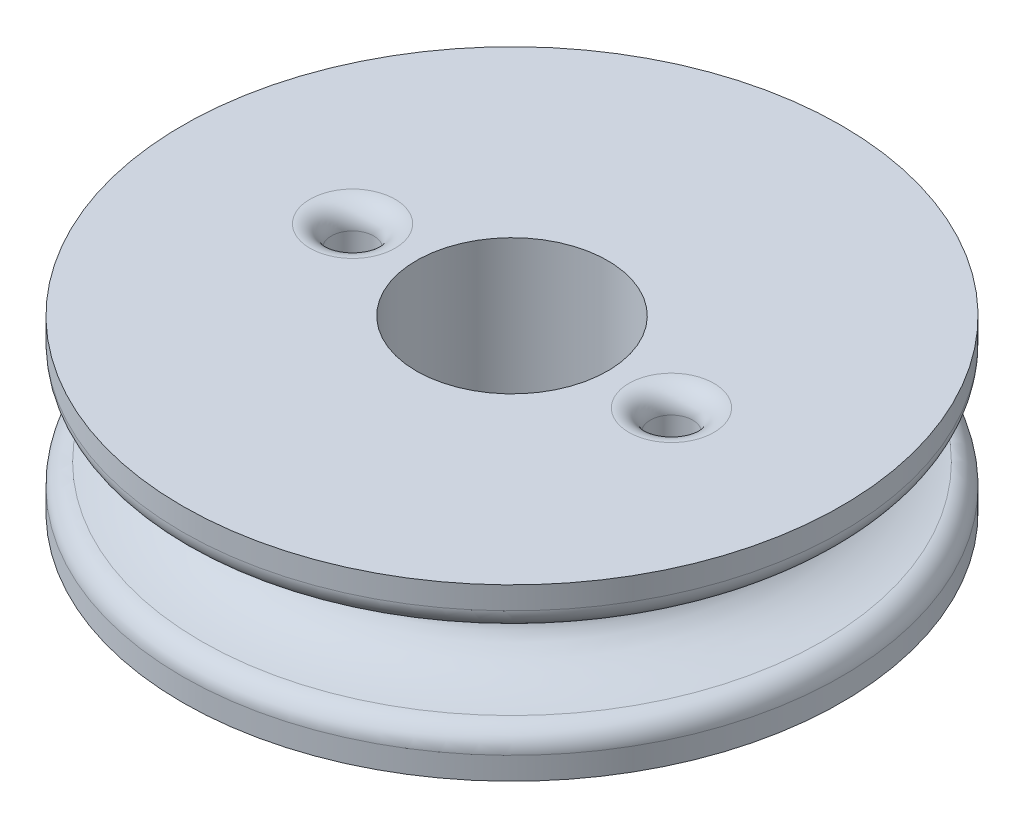
ISO-10303-21;
HEADER;
FILE_DESCRIPTION(('STEP AP214'),'2;1');
FILE_NAME('part.step','',(''),(''),'','','');
FILE_SCHEMA(('AUTOMOTIVE_DESIGN { 1 0 10303 214 1 1 1 1 }'));
ENDSEC;
DATA;
#1=APPLICATION_CONTEXT('core data for automotive mechanical design processes');
#2=APPLICATION_PROTOCOL_DEFINITION('international standard','automotive_design',2000,#1);
#3=PRODUCT_CONTEXT('',#1,'mechanical');
#4=PRODUCT('Part','Part','',(#3));
#5=PRODUCT_RELATED_PRODUCT_CATEGORY('part','',(#4));
#6=PRODUCT_DEFINITION_FORMATION('','',#4);
#7=PRODUCT_DEFINITION_CONTEXT('part definition',#1,'design');
#8=PRODUCT_DEFINITION('design','',#6,#7);
#9=PRODUCT_DEFINITION_SHAPE('','',#8);
#10=(LENGTH_UNIT() NAMED_UNIT(*) SI_UNIT(.MILLI.,.METRE.));
#11=(NAMED_UNIT(*) PLANE_ANGLE_UNIT() SI_UNIT($,.RADIAN.));
#12=(NAMED_UNIT(*) SI_UNIT($,.STERADIAN.) SOLID_ANGLE_UNIT());
#13=UNCERTAINTY_MEASURE_WITH_UNIT(LENGTH_MEASURE(1.E-05),#10,'distance_accuracy_value','');
#14=(GEOMETRIC_REPRESENTATION_CONTEXT(3) GLOBAL_UNCERTAINTY_ASSIGNED_CONTEXT((#13)) GLOBAL_UNIT_ASSIGNED_CONTEXT((#10,
#11,#12)) REPRESENTATION_CONTEXT('',''));
#15=CARTESIAN_POINT('',(0.,0.,0.));
#16=DIRECTION('',(0.,0.,1.));
#17=DIRECTION('',(1.,0.,0.));
#18=AXIS2_PLACEMENT_3D('',#15,#16,#17);
#19=CARTESIAN_POINT('',(0.,8.,0.));
#20=DIRECTION('',(0.,-1.,0.));
#21=DIRECTION('',(0.,0.,-1.));
#22=AXIS2_PLACEMENT_3D('',#19,#20,#21);
#23=CYLINDRICAL_SURFACE('',#22,15.5);
#24=CARTESIAN_POINT('',(0.,6.94380209251713,0.));
#25=DIRECTION('',(0.,-1.,0.));
#26=DIRECTION('',(0.,0.,-1.));
#27=AXIS2_PLACEMENT_3D('',#24,#25,#26);
#28=CIRCLE('',#27,15.5);
#29=CARTESIAN_POINT('',(0.,6.94380209251713,-15.5));
#30=VERTEX_POINT('',#29);
#31=EDGE_CURVE('E10',#30,#30,#28,.F.);
#32=ORIENTED_EDGE('',*,*,#31,.T.);
#33=EDGE_LOOP('',(#32));
#34=FACE_BOUND('',#33,.T.);
#35=CARTESIAN_POINT('',(0.,8.,0.));
#36=DIRECTION('',(0.,1.,0.));
#37=DIRECTION('',(0.,0.,1.));
#38=AXIS2_PLACEMENT_3D('',#35,#36,#37);
#39=CIRCLE('',#38,15.5);
#40=CARTESIAN_POINT('',(0.,8.,15.5));
#41=VERTEX_POINT('',#40);
#42=EDGE_CURVE('E63',#41,#41,#39,.T.);
#43=ORIENTED_EDGE('',*,*,#42,.F.);
#44=EDGE_LOOP('',(#43));
#45=FACE_BOUND('',#44,.T.);
#46=ADVANCED_FACE('F31',(#34,#45),#23,.T.);
#47=CARTESIAN_POINT('',(0.,8.,0.));
#48=DIRECTION('',(0.,1.,0.));
#49=DIRECTION('',(0.,0.,1.));
#50=AXIS2_PLACEMENT_3D('',#47,#48,#49);
#51=PLANE('',#50);
#52=CARTESIAN_POINT('',(7.5,8.,0.));
#53=DIRECTION('',(0.,1.,0.));
#54=DIRECTION('',(0.,0.,1.));
#55=AXIS2_PLACEMENT_3D('',#52,#53,#54);
#56=CIRCLE('',#55,2.);
#57=CARTESIAN_POINT('',(7.5,8.,2.));
#58=VERTEX_POINT('',#57);
#59=EDGE_CURVE('E54',#58,#58,#56,.F.);
#60=ORIENTED_EDGE('',*,*,#59,.T.);
#61=EDGE_LOOP('',(#60));
#62=FACE_BOUND('',#61,.T.);
#63=CARTESIAN_POINT('',(-7.5,8.,0.));
#64=DIRECTION('',(0.,1.,0.));
#65=DIRECTION('',(0.,0.,1.));
#66=AXIS2_PLACEMENT_3D('',#63,#64,#65);
#67=CIRCLE('',#66,2.);
#68=CARTESIAN_POINT('',(-7.5,8.,2.));
#69=VERTEX_POINT('',#68);
#70=EDGE_CURVE('E57',#69,#69,#67,.F.);
#71=ORIENTED_EDGE('',*,*,#70,.T.);
#72=EDGE_LOOP('',(#71));
#73=FACE_BOUND('',#72,.T.);
#74=ORIENTED_EDGE('',*,*,#42,.T.);
#75=EDGE_LOOP('',(#74));
#76=FACE_BOUND('',#75,.T.);
#77=CARTESIAN_POINT('',(0.,8.,0.));
#78=DIRECTION('',(0.,1.,0.));
#79=DIRECTION('',(0.,0.,1.));
#80=AXIS2_PLACEMENT_3D('',#77,#78,#79);
#81=CIRCLE('',#80,4.5);
#82=CARTESIAN_POINT('',(0.,8.,4.5));
#83=VERTEX_POINT('',#82);
#84=EDGE_CURVE('E67',#83,#83,#81,.T.);
#85=ORIENTED_EDGE('',*,*,#84,.F.);
#86=EDGE_LOOP('',(#85));
#87=FACE_BOUND('',#86,.T.);
#88=ADVANCED_FACE('F103',(#62,#73,#76,#87),#51,.T.);
#89=CARTESIAN_POINT('',(0.,0.,0.));
#90=DIRECTION('',(0.,1.,0.));
#91=DIRECTION('',(0.,0.,1.));
#92=AXIS2_PLACEMENT_3D('',#89,#90,#91);
#93=PLANE('',#92);
#94=CARTESIAN_POINT('',(0.,0.,0.));
#95=DIRECTION('',(0.,1.,0.));
#96=DIRECTION('',(0.,0.,1.));
#97=AXIS2_PLACEMENT_3D('',#94,#95,#96);
#98=CIRCLE('',#97,15.5);
#99=CARTESIAN_POINT('',(0.,0.,15.5));
#100=VERTEX_POINT('',#99);
#101=EDGE_CURVE('E64',#100,#100,#98,.T.);
#102=ORIENTED_EDGE('',*,*,#101,.F.);
#103=EDGE_LOOP('',(#102));
#104=FACE_BOUND('',#103,.T.);
#105=CARTESIAN_POINT('',(0.,0.,0.));
#106=DIRECTION('',(0.,1.,0.));
#107=DIRECTION('',(0.,0.,1.));
#108=AXIS2_PLACEMENT_3D('',#105,#106,#107);
#109=CIRCLE('',#108,4.5);
#110=CARTESIAN_POINT('',(0.,0.,4.5));
#111=VERTEX_POINT('',#110);
#112=EDGE_CURVE('E70',#111,#111,#109,.T.);
#113=ORIENTED_EDGE('',*,*,#112,.T.);
#114=EDGE_LOOP('',(#113));
#115=FACE_BOUND('',#114,.T.);
#116=CARTESIAN_POINT('',(7.5,0.,0.));
#117=DIRECTION('',(0.,1.,0.));
#118=DIRECTION('',(0.,0.,1.));
#119=AXIS2_PLACEMENT_3D('',#116,#117,#118);
#120=CIRCLE('',#119,1.);
#121=CARTESIAN_POINT('',(7.5,0.,1.));
#122=VERTEX_POINT('',#121);
#123=EDGE_CURVE('E73',#122,#122,#120,.T.);
#124=ORIENTED_EDGE('',*,*,#123,.T.);
#125=EDGE_LOOP('',(#124));
#126=FACE_BOUND('',#125,.T.);
#127=CARTESIAN_POINT('',(-7.5,0.,0.));
#128=DIRECTION('',(0.,1.,0.));
#129=DIRECTION('',(0.,0.,-1.));
#130=AXIS2_PLACEMENT_3D('',#127,#128,#129);
#131=CIRCLE('',#130,1.);
#132=CARTESIAN_POINT('',(-7.5,0.,-1.));
#133=VERTEX_POINT('',#132);
#134=EDGE_CURVE('E78',#133,#133,#131,.T.);
#135=ORIENTED_EDGE('',*,*,#134,.T.);
#136=EDGE_LOOP('',(#135));
#137=FACE_BOUND('',#136,.T.);
#138=ADVANCED_FACE('F106',(#104,#115,#126,#137),#93,.F.);
#139=CARTESIAN_POINT('',(0.,1.05619790748287,0.));
#140=DIRECTION('',(0.,-1.,0.));
#141=DIRECTION('',(0.,0.,-1.));
#142=AXIS2_PLACEMENT_3D('',#139,#140,#141);
#143=CIRCLE('',#142,15.5);
#144=CARTESIAN_POINT('',(0.,1.05619790748287,-15.5));
#145=VERTEX_POINT('',#144);
#146=EDGE_CURVE('E38',#145,#145,#143,.T.);
#147=ORIENTED_EDGE('',*,*,#146,.T.);
#148=EDGE_LOOP('',(#147));
#149=FACE_BOUND('',#148,.T.);
#150=ORIENTED_EDGE('',*,*,#101,.T.);
#151=EDGE_LOOP('',(#150));
#152=FACE_BOUND('',#151,.T.);
#153=ADVANCED_FACE('F101',(#149,#152),#23,.T.);
#154=CARTESIAN_POINT('',(0.,8.,0.));
#155=DIRECTION('',(0.,-1.,0.));
#156=DIRECTION('',(0.,0.,-1.));
#157=AXIS2_PLACEMENT_3D('',#154,#155,#156);
#158=CYLINDRICAL_SURFACE('',#157,4.5);
#159=ORIENTED_EDGE('',*,*,#84,.T.);
#160=EDGE_LOOP('',(#159));
#161=FACE_BOUND('',#160,.T.);
#162=ORIENTED_EDGE('',*,*,#112,.F.);
#163=EDGE_LOOP('',(#162));
#164=FACE_BOUND('',#163,.T.);
#165=ADVANCED_FACE('F97',(#161,#164),#158,.F.);
#166=CARTESIAN_POINT('',(7.5,8.,0.));
#167=DIRECTION('',(0.,-1.,0.));
#168=DIRECTION('',(0.,0.,-1.));
#169=AXIS2_PLACEMENT_3D('',#166,#167,#168);
#170=CYLINDRICAL_SURFACE('',#169,1.);
#171=CARTESIAN_POINT('',(7.5,7.,0.));
#172=DIRECTION('',(0.,1.,0.));
#173=DIRECTION('',(0.,0.,1.));
#174=AXIS2_PLACEMENT_3D('',#171,#172,#173);
#175=CIRCLE('',#174,1.);
#176=CARTESIAN_POINT('',(7.5,7.,1.));
#177=VERTEX_POINT('',#176);
#178=EDGE_CURVE('E60',#177,#177,#175,.T.);
#179=ORIENTED_EDGE('',*,*,#178,.T.);
#180=EDGE_LOOP('',(#179));
#181=FACE_BOUND('',#180,.T.);
#182=ORIENTED_EDGE('',*,*,#123,.F.);
#183=EDGE_LOOP('',(#182));
#184=FACE_BOUND('',#183,.T.);
#185=ADVANCED_FACE('F93',(#181,#184),#170,.F.);
#186=CARTESIAN_POINT('',(-7.5,8.,0.));
#187=DIRECTION('',(0.,-1.,0.));
#188=DIRECTION('',(0.,0.,-1.));
#189=AXIS2_PLACEMENT_3D('',#186,#187,#188);
#190=CYLINDRICAL_SURFACE('',#189,1.);
#191=CARTESIAN_POINT('',(-7.5,7.,0.));
#192=DIRECTION('',(0.,1.,0.));
#193=DIRECTION('',(0.,0.,1.));
#194=AXIS2_PLACEMENT_3D('',#191,#192,#193);
#195=CIRCLE('',#194,1.);
#196=CARTESIAN_POINT('',(-7.5,7.,1.));
#197=VERTEX_POINT('',#196);
#198=EDGE_CURVE('E51',#197,#197,#195,.T.);
#199=ORIENTED_EDGE('',*,*,#198,.T.);
#200=EDGE_LOOP('',(#199));
#201=FACE_BOUND('',#200,.T.);
#202=ORIENTED_EDGE('',*,*,#134,.F.);
#203=EDGE_LOOP('',(#202));
#204=FACE_BOUND('',#203,.T.);
#205=ADVANCED_FACE('F89',(#201,#204),#190,.F.);
#206=CARTESIAN_POINT('',(7.5,7.,0.));
#207=DIRECTION('',(0.,1.,0.));
#208=DIRECTION('',(0.,0.,1.));
#209=AXIS2_PLACEMENT_3D('',#206,#207,#208);
#210=TOROIDAL_SURFACE('',#209,2.,1.);
#211=ORIENTED_EDGE('',*,*,#59,.F.);
#212=EDGE_LOOP('',(#211));
#213=FACE_BOUND('',#212,.T.);
#214=ORIENTED_EDGE('',*,*,#178,.F.);
#215=EDGE_LOOP('',(#214));
#216=FACE_BOUND('',#215,.T.);
#217=ADVANCED_FACE('F92',(#213,#216),#210,.T.);
#218=CARTESIAN_POINT('',(-7.5,7.,0.));
#219=DIRECTION('',(0.,1.,0.));
#220=DIRECTION('',(0.,0.,1.));
#221=AXIS2_PLACEMENT_3D('',#218,#219,#220);
#222=TOROIDAL_SURFACE('',#221,2.,1.);
#223=ORIENTED_EDGE('',*,*,#70,.F.);
#224=EDGE_LOOP('',(#223));
#225=FACE_BOUND('',#224,.T.);
#226=ORIENTED_EDGE('',*,*,#198,.F.);
#227=EDGE_LOOP('',(#226));
#228=FACE_BOUND('',#227,.T.);
#229=ADVANCED_FACE('F87',(#225,#228),#222,.T.);
#230=CARTESIAN_POINT('',(-15.5,4.,0.));
#231=DIRECTION('',(0.,0.,1.));
#232=DIRECTION('',(-1.,0.,0.));
#233=AXIS2_PLACEMENT_3D('',#230,#231,#232);
#234=ELLIPSE('',#233,4.,2.);
#235=CARTESIAN_POINT('',(0.,9.60473432394892,0.));
#236=DIRECTION('',(0.,1.,0.));
#237=AXIS1_PLACEMENT('',#235,#236);
#238=SURFACE_OF_REVOLUTION('',#234,#237);
#239=CARTESIAN_POINT('',(0.,2.04979511794458,0.));
#240=DIRECTION('',(0.,1.,0.));
#241=DIRECTION('',(0.,0.,1.));
#242=AXIS2_PLACEMENT_3D('',#239,#240,#241);
#243=CIRCLE('',#242,14.612980455667);
#244=CARTESIAN_POINT('',(0.,2.04979511794458,14.612980455667));
#245=VERTEX_POINT('',#244);
#246=EDGE_CURVE('E42',#245,#245,#243,.T.);
#247=ORIENTED_EDGE('',*,*,#246,.T.);
#248=EDGE_LOOP('',(#247));
#249=FACE_BOUND('',#248,.T.);
#250=CARTESIAN_POINT('',(0.,5.95020488205542,0.));
#251=DIRECTION('',(0.,1.,0.));
#252=DIRECTION('',(0.,0.,1.));
#253=AXIS2_PLACEMENT_3D('',#250,#251,#252);
#254=CIRCLE('',#253,14.612980455667);
#255=CARTESIAN_POINT('',(0.,5.95020488205542,14.612980455667));
#256=VERTEX_POINT('',#255);
#257=EDGE_CURVE('E46',#256,#256,#254,.F.);
#258=ORIENTED_EDGE('',*,*,#257,.T.);
#259=EDGE_LOOP('',(#258));
#260=FACE_BOUND('',#259,.T.);
#261=ADVANCED_FACE('F83',(#249,#260),#238,.T.);
#262=CARTESIAN_POINT('',(0.,1.05619790748287,0.));
#263=DIRECTION('',(0.,-1.,0.));
#264=DIRECTION('',(0.,0.,-1.));
#265=AXIS2_PLACEMENT_3D('',#262,#263,#264);
#266=TOROIDAL_SURFACE('',#265,14.5,1.);
#267=ORIENTED_EDGE('',*,*,#146,.F.);
#268=EDGE_LOOP('',(#267));
#269=FACE_BOUND('',#268,.T.);
#270=ORIENTED_EDGE('',*,*,#246,.F.);
#271=EDGE_LOOP('',(#270));
#272=FACE_BOUND('',#271,.T.);
#273=ADVANCED_FACE('F86',(#269,#272),#266,.T.);
#274=CARTESIAN_POINT('',(0.,6.94380209251713,0.));
#275=DIRECTION('',(0.,-1.,0.));
#276=DIRECTION('',(0.,0.,-1.));
#277=AXIS2_PLACEMENT_3D('',#274,#275,#276);
#278=TOROIDAL_SURFACE('',#277,14.5,1.);
#279=ORIENTED_EDGE('',*,*,#257,.F.);
#280=EDGE_LOOP('',(#279));
#281=FACE_BOUND('',#280,.T.);
#282=ORIENTED_EDGE('',*,*,#31,.F.);
#283=EDGE_LOOP('',(#282));
#284=FACE_BOUND('',#283,.T.);
#285=ADVANCED_FACE('F33',(#281,#284),#278,.T.);
#286=CLOSED_SHELL('',(#46,#88,#138,#153,#165,#185,#205,#217,#229,#261,#273,#285));
#287=MANIFOLD_SOLID_BREP('B2',#286);
#288=ADVANCED_BREP_SHAPE_REPRESENTATION('',(#18,#287),#14);
#289=SHAPE_DEFINITION_REPRESENTATION(#9,#288);
ENDSEC;
END-ISO-10303-21;
